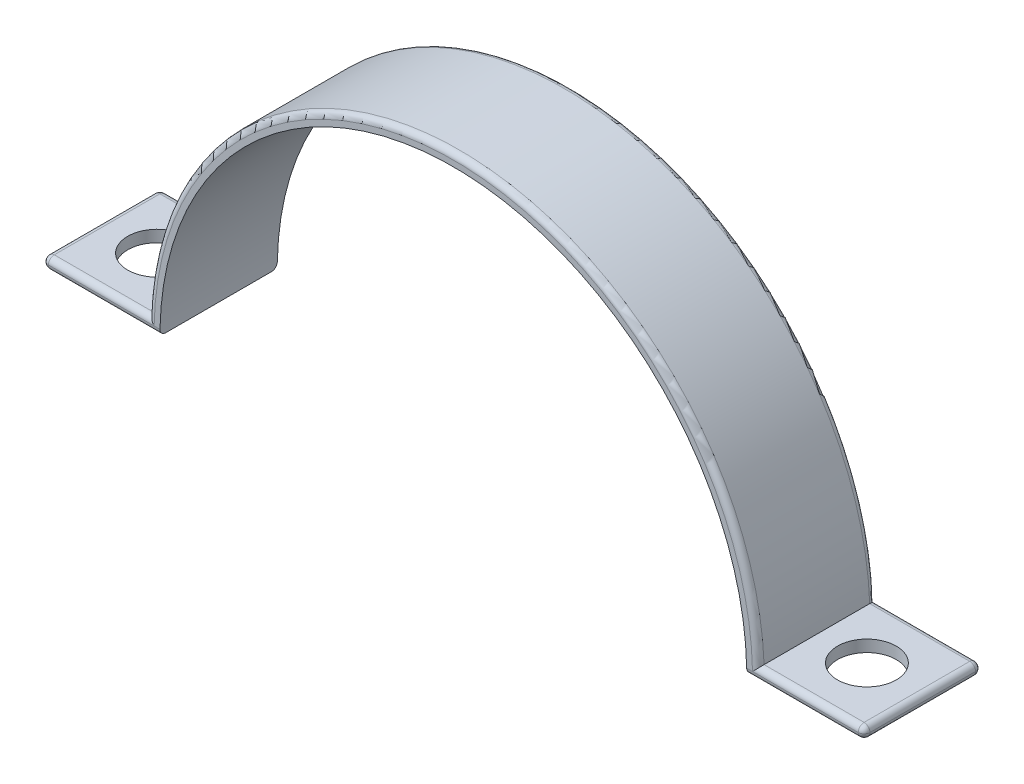
ISO-10303-21;
HEADER;
FILE_DESCRIPTION(('STEP AP214'),'2;1');
FILE_NAME('part.step','',(''),(''),'','','');
FILE_SCHEMA(('AUTOMOTIVE_DESIGN { 1 0 10303 214 1 1 1 1 }'));
ENDSEC;
DATA;
#1=APPLICATION_CONTEXT('core data for automotive mechanical design processes');
#2=APPLICATION_PROTOCOL_DEFINITION('international standard','automotive_design',2000,#1);
#3=PRODUCT_CONTEXT('',#1,'mechanical');
#4=PRODUCT('Part','Part','',(#3));
#5=PRODUCT_RELATED_PRODUCT_CATEGORY('part','',(#4));
#6=PRODUCT_DEFINITION_FORMATION('','',#4);
#7=PRODUCT_DEFINITION_CONTEXT('part definition',#1,'design');
#8=PRODUCT_DEFINITION('design','',#6,#7);
#9=PRODUCT_DEFINITION_SHAPE('','',#8);
#10=(LENGTH_UNIT() NAMED_UNIT(*) SI_UNIT(.MILLI.,.METRE.));
#11=(NAMED_UNIT(*) PLANE_ANGLE_UNIT() SI_UNIT($,.RADIAN.));
#12=(NAMED_UNIT(*) SI_UNIT($,.STERADIAN.) SOLID_ANGLE_UNIT());
#13=UNCERTAINTY_MEASURE_WITH_UNIT(LENGTH_MEASURE(1.E-05),#10,'distance_accuracy_value','');
#14=(GEOMETRIC_REPRESENTATION_CONTEXT(3) GLOBAL_UNCERTAINTY_ASSIGNED_CONTEXT((#13)) GLOBAL_UNIT_ASSIGNED_CONTEXT((#10,
#11,#12)) REPRESENTATION_CONTEXT('',''));
#15=CARTESIAN_POINT('',(0.,0.,0.));
#16=DIRECTION('',(0.,0.,1.));
#17=DIRECTION('',(1.,0.,0.));
#18=AXIS2_PLACEMENT_3D('',#15,#16,#17);
#19=CARTESIAN_POINT('',(0.,0.,20.));
#20=DIRECTION('',(0.,0.,-1.));
#21=DIRECTION('',(-1.,0.,0.));
#22=AXIS2_PLACEMENT_3D('',#19,#20,#21);
#23=CYLINDRICAL_SURFACE('',#22,50.);
#24=DIRECTION('',(0.,0.,-1.));
#25=VECTOR('',#24,1.);
#26=CARTESIAN_POINT('',(50.,0.,20.));
#27=LINE('',#26,#25);
#28=CARTESIAN_POINT('',(50.,0.,19.));
#29=VERTEX_POINT('',#28);
#30=CARTESIAN_POINT('',(50.,0.,1.));
#31=VERTEX_POINT('',#30);
#32=EDGE_CURVE('E165',#29,#31,#27,.T.);
#33=ORIENTED_EDGE('',*,*,#32,.F.);
#34=CARTESIAN_POINT('',(50.,0.,19.));
#35=CARTESIAN_POINT('',(49.9999998631864,1.87141236881629E-07,19.0281346403129));
#36=CARTESIAN_POINT('',(50.0000000153744,0.00118808187561963,19.0562558019718));
#37=CARTESIAN_POINT('',(49.9999997315055,0.00592707756846529,19.1122968966231));
#38=CARTESIAN_POINT('',(49.9999992954768,0.00947806520868897,19.1402168391998));
#39=CARTESIAN_POINT('',(49.9999953602963,0.0236419446843292,19.2233260784685));
#40=CARTESIAN_POINT('',(49.9999892412786,0.0377658465877786,19.2779586779832));
#41=CARTESIAN_POINT('',(49.9999471952478,0.0749847040579029,19.3840757024503));
#42=CARTESIAN_POINT('',(49.9999112539095,0.0980839681256297,19.4355586016728));
#43=CARTESIAN_POINT('',(49.9997745451526,0.152595409569771,19.5339141215954));
#44=CARTESIAN_POINT('',(49.9996737891469,0.184006122865026,19.5807875522715));
#45=CARTESIAN_POINT('',(49.9993658705842,0.254248519704559,19.6685928695787));
#46=CARTESIAN_POINT('',(49.9991587108456,0.293080006675595,19.7095249135442));
#47=CARTESIAN_POINT('',(49.9985957444102,0.377072144063286,19.7842972638465));
#48=CARTESIAN_POINT('',(49.9982399088935,0.42223402046767,19.8181361933055));
#49=CARTESIAN_POINT('',(49.9973435781473,0.517597393023219,19.8777537113069));
#50=CARTESIAN_POINT('',(49.9968030598717,0.567799517583145,19.9035312931227));
#51=CARTESIAN_POINT('',(49.9955135302985,0.671806447347662,19.9462797556067));
#52=CARTESIAN_POINT('',(49.994764640941,0.72560913153568,19.9632557704274));
#53=CARTESIAN_POINT('',(49.9933466602282,0.816450495060021,19.9837054885176));
#54=CARTESIAN_POINT('',(49.9927380940072,0.852919151252185,19.9898123691724));
#55=CARTESIAN_POINT('',(49.9914333721997,0.926253741143391,19.9979590931483));
#56=CARTESIAN_POINT('',(49.9907373424091,0.963119036097511,20.0000047080428));
#57=CARTESIAN_POINT('',(49.9899989998,1.,20.));
#58=B_SPLINE_CURVE_WITH_KNOTS('',3,(#34,#35,#36,#37,#38,#39,#40,#41,#42,#43,#44,#45,#46,#47,#48,
#49,#50,#51,#52,#53,#54,#55,#56,#57),.UNSPECIFIED.,.F.,.F.,(4,2,2,2,2,2,2,2,2,2,2,4),(0.,
0.0843520780065056,0.168700111339095,0.337118089257266,0.505617014025194,0.674086277051336,
0.842551078014438,1.01104855024937,1.17956705658551,1.34798715136615,1.45872081802652,
1.56929700514025),.UNSPECIFIED.);
#59=CARTESIAN_POINT('',(49.9899989998,1.,20.));
#60=VERTEX_POINT('',#59);
#61=EDGE_CURVE('E180',#29,#60,#58,.T.);
#62=ORIENTED_EDGE('',*,*,#61,.T.);
#63=CARTESIAN_POINT('',(0.,0.,20.));
#64=DIRECTION('',(0.,0.,-1.));
#65=DIRECTION('',(1.,0.,0.));
#66=AXIS2_PLACEMENT_3D('',#63,#64,#65);
#67=CIRCLE('',#66,50.);
#68=CARTESIAN_POINT('',(-49.9899989998,1.,20.));
#69=VERTEX_POINT('',#68);
#70=EDGE_CURVE('E161',#69,#60,#67,.T.);
#71=ORIENTED_EDGE('',*,*,#70,.F.);
#72=CARTESIAN_POINT('',(-49.9899989998,1.,20.));
#73=CARTESIAN_POINT('',(-49.9905618169273,0.971871419776289,19.9999998131516));
#74=CARTESIAN_POINT('',(-49.9911003274459,0.943755817033135,19.9988124284928));
#75=CARTESIAN_POINT('',(-49.9921266601252,0.887724773096459,19.994075227252));
#76=CARTESIAN_POINT('',(-49.9926144846497,0.859809322625408,19.990525520894));
#77=CARTESIAN_POINT('',(-49.9939973726587,0.776711854413031,19.9763662558612));
#78=CARTESIAN_POINT('',(-49.9948137171232,0.722084957229491,19.962246459446));
#79=CARTESIAN_POINT('',(-49.9962338543462,0.615975418546915,19.9250362270946));
#80=CARTESIAN_POINT('',(-49.9968375434462,0.564494320539792,19.9019414278125));
#81=CARTESIAN_POINT('',(-49.9978512799179,0.466140016660135,19.8474385230773));
#82=CARTESIAN_POINT('',(-49.9982613617648,0.41926599159476,19.816031899247));
#83=CARTESIAN_POINT('',(-49.9989206381703,0.331461702605881,19.7457999437537));
#84=CARTESIAN_POINT('',(-49.9991698511632,0.290530758073257,19.7069754627741));
#85=CARTESIAN_POINT('',(-49.9995484992326,0.215757973924678,19.6229969608851));
#86=CARTESIAN_POINT('',(-49.9996779107741,0.181917528251355,19.5778416982949));
#87=CARTESIAN_POINT('',(-49.999859373654,0.122291120517832,19.4824845222279));
#88=CARTESIAN_POINT('',(-49.9999114063117,0.0965071046293529,19.4322813932159));
#89=CARTESIAN_POINT('',(-49.9999757137407,0.0537461031393642,19.3282689399094));
#90=CARTESIAN_POINT('',(-49.9999880117839,0.0367639673397247,19.274461745305));
#91=CARTESIAN_POINT('',(-49.9999979976424,0.0163045231797023,19.1836050282424));
#92=CARTESIAN_POINT('',(-49.9999992464419,0.0101940376134749,19.1471266838145));
#93=CARTESIAN_POINT('',(-50.0000000054489,0.00204230346881125,19.0737706546755));
#94=CARTESIAN_POINT('',(-49.9999995181207,-4.70654190077639E-06,19.0368936100163));
#95=CARTESIAN_POINT('',(-50.,0.,19.));
#96=B_SPLINE_CURVE_WITH_KNOTS('',3,(#72,#73,#74,#75,#76,#77,#78,#79,#80,#81,#82,#83,#84,#85,#86,
#87,#88,#89,#90,#91,#92,#93,#94,#95),.UNSPECIFIED.,.F.,.F.,(4,2,2,2,2,2,2,2,2,2,2,4),(0.,
0.0843508233307579,0.168697711192303,0.337113723688326,0.505611717047594,0.674079695032367,
0.842528364607866,1.01101011900985,1.17953254172091,1.34795624614968,1.45870521936915,
1.56929705376736),.UNSPECIFIED.);
#97=CARTESIAN_POINT('',(-50.,0.,19.));
#98=VERTEX_POINT('',#97);
#99=EDGE_CURVE('E168',#69,#98,#96,.T.);
#100=ORIENTED_EDGE('',*,*,#99,.T.);
#101=DIRECTION('',(0.,0.,-1.));
#102=VECTOR('',#101,1.);
#103=CARTESIAN_POINT('',(-50.,0.,20.));
#104=LINE('',#103,#102);
#105=CARTESIAN_POINT('',(-50.,0.,1.));
#106=VERTEX_POINT('',#105);
#107=EDGE_CURVE('E181',#98,#106,#104,.T.);
#108=ORIENTED_EDGE('',*,*,#107,.T.);
#109=CARTESIAN_POINT('',(-50.,0.,1.));
#110=CARTESIAN_POINT('',(-49.9999998631864,1.87141236852758E-07,0.971865359687098));
#111=CARTESIAN_POINT('',(-50.0000000153744,0.00118808187561959,0.943744198028183));
#112=CARTESIAN_POINT('',(-49.9999997315055,0.00592707756846532,0.88770310337686));
#113=CARTESIAN_POINT('',(-49.9999992954768,0.00947806520868904,0.859783160800213));
#114=CARTESIAN_POINT('',(-49.9999953602963,0.0236419446843296,0.776673921531546));
#115=CARTESIAN_POINT('',(-49.9999892412786,0.0377658465877793,0.722041322016747));
#116=CARTESIAN_POINT('',(-49.9999471952478,0.0749847040579041,0.615924297549664));
#117=CARTESIAN_POINT('',(-49.9999112539095,0.0980839681256311,0.564441398327159));
#118=CARTESIAN_POINT('',(-49.9997745451526,0.152595409569773,0.466085878404552));
#119=CARTESIAN_POINT('',(-49.9996737891469,0.184006122865027,0.419212447728523));
#120=CARTESIAN_POINT('',(-49.9993658705842,0.25424851970456,0.331407130421346));
#121=CARTESIAN_POINT('',(-49.9991587108456,0.293080006675596,0.290475086455833));
#122=CARTESIAN_POINT('',(-49.9985957444102,0.377072144063287,0.215702736153533));
#123=CARTESIAN_POINT('',(-49.9982399088935,0.422234020467671,0.181863806694507));
#124=CARTESIAN_POINT('',(-49.9973435781473,0.51759739302322,0.122246288693089));
#125=CARTESIAN_POINT('',(-49.9968030598717,0.567799517583146,0.0964687068772508));
#126=CARTESIAN_POINT('',(-49.9955135302985,0.671806447347664,0.0537202443932561));
#127=CARTESIAN_POINT('',(-49.994764640941,0.725609131535682,0.036744229572606));
#128=CARTESIAN_POINT('',(-49.9933466602282,0.816450495060023,0.0162945114824068));
#129=CARTESIAN_POINT('',(-49.9927380940072,0.852919151252186,0.0101876308275691));
#130=CARTESIAN_POINT('',(-49.9914333721997,0.926253741143392,0.00204090685173931));
#131=CARTESIAN_POINT('',(-49.9907373424091,0.96311903609751,-4.70804282663039E-06));
#132=CARTESIAN_POINT('',(-49.9899989998,1.,0.));
#133=B_SPLINE_CURVE_WITH_KNOTS('',3,(#109,#110,#111,#112,#113,#114,#115,#116,#117,#118,#119,
#120,#121,#122,#123,#124,#125,#126,#127,#128,#129,#130,#131,#132),.UNSPECIFIED.,.F.,.F.,(4,2,2,
2,2,2,2,2,2,2,2,4),(0.,0.0843520780065075,0.168700111339098,0.337118089257268,0.505617014025199,
0.674086277051338,0.842551078014439,1.01104855024937,1.17956705658551,1.34798715136616,
1.45872081802652,1.56929700514025),.UNSPECIFIED.);
#134=CARTESIAN_POINT('',(-49.9899989998,1.,0.));
#135=VERTEX_POINT('',#134);
#136=EDGE_CURVE('E176',#106,#135,#133,.T.);
#137=ORIENTED_EDGE('',*,*,#136,.T.);
#138=CARTESIAN_POINT('',(0.,0.,0.));
#139=DIRECTION('',(0.,0.,-1.));
#140=DIRECTION('',(1.,0.,0.));
#141=AXIS2_PLACEMENT_3D('',#138,#139,#140);
#142=CIRCLE('',#141,50.);
#143=CARTESIAN_POINT('',(49.9899989998,1.,0.));
#144=VERTEX_POINT('',#143);
#145=EDGE_CURVE('E182',#135,#144,#142,.T.);
#146=ORIENTED_EDGE('',*,*,#145,.T.);
#147=CARTESIAN_POINT('',(49.9899989998,1.,0.));
#148=CARTESIAN_POINT('',(49.9905618169273,0.971871419776289,1.8684843894341E-07));
#149=CARTESIAN_POINT('',(49.9911003274459,0.943755817033135,0.00118757150715081));
#150=CARTESIAN_POINT('',(49.9921266601252,0.887724773096459,0.00592477274801115));
#151=CARTESIAN_POINT('',(49.9926144846497,0.859809322625408,0.00947447910602955));
#152=CARTESIAN_POINT('',(49.9939973726587,0.776711854413032,0.0236337441388272));
#153=CARTESIAN_POINT('',(49.9948137171232,0.722084957229491,0.0377535405539762));
#154=CARTESIAN_POINT('',(49.9962338543462,0.615975418546915,0.0749637729053945));
#155=CARTESIAN_POINT('',(49.9968375434462,0.564494320539791,0.0980585721874759));
#156=CARTESIAN_POINT('',(49.9978512799179,0.466140016660134,0.152561476922694));
#157=CARTESIAN_POINT('',(49.9982613617648,0.419265991594761,0.183968100752958));
#158=CARTESIAN_POINT('',(49.9989206381703,0.331461702605881,0.254200056246344));
#159=CARTESIAN_POINT('',(49.9991698511632,0.290530758073257,0.293024537225849));
#160=CARTESIAN_POINT('',(49.9995484992326,0.215757973924678,0.377003039114936));
#161=CARTESIAN_POINT('',(49.9996779107741,0.181917528251355,0.422158301705106));
#162=CARTESIAN_POINT('',(49.999859373654,0.122291120517833,0.517515477772131));
#163=CARTESIAN_POINT('',(49.9999114063117,0.0965071046293539,0.567718606784102));
#164=CARTESIAN_POINT('',(49.9999757137407,0.053746103139365,0.671731060090621));
#165=CARTESIAN_POINT('',(49.9999880117839,0.0367639673397253,0.725538254695006));
#166=CARTESIAN_POINT('',(49.9999979976424,0.0163045231797029,0.816394971757621));
#167=CARTESIAN_POINT('',(49.9999992464419,0.0101940376134754,0.852873316185527));
#168=CARTESIAN_POINT('',(50.0000000054489,0.00204230346881128,0.926229345324475));
#169=CARTESIAN_POINT('',(49.9999995181207,-4.70654190093722E-06,0.963106389983723));
#170=CARTESIAN_POINT('',(50.,0.,1.));
#171=B_SPLINE_CURVE_WITH_KNOTS('',3,(#147,#148,#149,#150,#151,#152,#153,#154,#155,#156,#157,
#158,#159,#160,#161,#162,#163,#164,#165,#166,#167,#168,#169,#170),.UNSPECIFIED.,.F.,.F.,(4,2,2,
2,2,2,2,2,2,2,2,4),(0.,0.0843508233307579,0.168697711192303,0.337113723688326,0.505611717047597,
0.674079695032367,0.842528364607865,1.01101011900985,1.17953254172091,1.34795624614968,
1.45870521936914,1.56929705376736),.UNSPECIFIED.);
#172=EDGE_CURVE('E228',#144,#31,#171,.T.);
#173=ORIENTED_EDGE('',*,*,#172,.T.);
#174=EDGE_LOOP('',(#33,#62,#71,#100,#108,#137,#146,#173));
#175=FACE_BOUND('',#174,.T.);
#176=ADVANCED_FACE('F35',(#175),#23,.F.);
#177=CARTESIAN_POINT('',(50.,0.,20.));
#178=DIRECTION('',(0.,1.,0.));
#179=DIRECTION('',(0.,0.,1.));
#180=AXIS2_PLACEMENT_3D('',#177,#178,#179);
#181=PLANE('',#180);
#182=CARTESIAN_POINT('',(60.4799919935936,0.,10.));
#183=DIRECTION('',(0.,1.,0.));
#184=DIRECTION('',(0.,0.,1.));
#185=AXIS2_PLACEMENT_3D('',#182,#183,#184);
#186=CIRCLE('',#185,5.);
#187=CARTESIAN_POINT('',(60.4799919935936,0.,15.));
#188=VERTEX_POINT('',#187);
#189=EDGE_CURVE('E510',#188,#188,#186,.T.);
#190=ORIENTED_EDGE('',*,*,#189,.T.);
#191=EDGE_LOOP('',(#190));
#192=FACE_BOUND('',#191,.T.);
#193=DIRECTION('',(0.,0.,-1.));
#194=VECTOR('',#193,1.);
#195=CARTESIAN_POINT('',(69.,0.,20.));
#196=LINE('',#195,#194);
#197=CARTESIAN_POINT('',(69.,0.,1.));
#198=VERTEX_POINT('',#197);
#199=CARTESIAN_POINT('',(69.,0.,19.));
#200=VERTEX_POINT('',#199);
#201=EDGE_CURVE('E366',#198,#200,#196,.F.);
#202=ORIENTED_EDGE('',*,*,#201,.T.);
#203=DIRECTION('',(1.,0.,0.));
#204=VECTOR('',#203,1.);
#205=CARTESIAN_POINT('',(50.,0.,19.));
#206=LINE('',#205,#204);
#207=EDGE_CURVE('E235',#200,#29,#206,.F.);
#208=ORIENTED_EDGE('',*,*,#207,.T.);
#209=ORIENTED_EDGE('',*,*,#32,.T.);
#210=DIRECTION('',(1.,0.,0.));
#211=VECTOR('',#210,1.);
#212=CARTESIAN_POINT('',(50.,0.,1.));
#213=LINE('',#212,#211);
#214=EDGE_CURVE('E367',#31,#198,#213,.T.);
#215=ORIENTED_EDGE('',*,*,#214,.T.);
#216=EDGE_LOOP('',(#202,#208,#209,#215));
#217=FACE_BOUND('',#216,.T.);
#218=ADVANCED_FACE('F219',(#192,#217),#181,.F.);
#219=CARTESIAN_POINT('',(51.9599839871872,2.,20.));
#220=DIRECTION('',(0.,-1.,0.));
#221=DIRECTION('',(0.,0.,-1.));
#222=AXIS2_PLACEMENT_3D('',#219,#220,#221);
#223=PLANE('',#222);
#224=CARTESIAN_POINT('',(60.4799919935936,2.,10.));
#225=DIRECTION('',(0.,1.,0.));
#226=DIRECTION('',(0.,0.,1.));
#227=AXIS2_PLACEMENT_3D('',#224,#225,#226);
#228=CIRCLE('',#227,5.);
#229=CARTESIAN_POINT('',(60.4799919935936,2.,15.));
#230=VERTEX_POINT('',#229);
#231=EDGE_CURVE('E190',#230,#230,#228,.T.);
#232=ORIENTED_EDGE('',*,*,#231,.F.);
#233=EDGE_LOOP('',(#232));
#234=FACE_BOUND('',#233,.T.);
#235=DIRECTION('',(0.,0.,-1.));
#236=VECTOR('',#235,1.);
#237=CARTESIAN_POINT('',(51.9599839871872,2.,20.));
#238=LINE('',#237,#236);
#239=CARTESIAN_POINT('',(51.9599839871872,2.,19.));
#240=VERTEX_POINT('',#239);
#241=CARTESIAN_POINT('',(51.9599839871872,2.,1.));
#242=VERTEX_POINT('',#241);
#243=EDGE_CURVE('E195',#240,#242,#238,.T.);
#244=ORIENTED_EDGE('',*,*,#243,.F.);
#245=DIRECTION('',(-1.,0.,0.));
#246=VECTOR('',#245,1.);
#247=CARTESIAN_POINT('',(69.,2.,19.));
#248=LINE('',#247,#246);
#249=CARTESIAN_POINT('',(69.,2.,19.));
#250=VERTEX_POINT('',#249);
#251=EDGE_CURVE('E389',#240,#250,#248,.F.);
#252=ORIENTED_EDGE('',*,*,#251,.T.);
#253=DIRECTION('',(0.,0.,-1.));
#254=VECTOR('',#253,1.);
#255=CARTESIAN_POINT('',(69.,2.,20.));
#256=LINE('',#255,#254);
#257=CARTESIAN_POINT('',(69.,2.,1.));
#258=VERTEX_POINT('',#257);
#259=EDGE_CURVE('E383',#250,#258,#256,.T.);
#260=ORIENTED_EDGE('',*,*,#259,.T.);
#261=DIRECTION('',(-1.,0.,0.));
#262=VECTOR('',#261,1.);
#263=CARTESIAN_POINT('',(51.9599839871872,2.,1.));
#264=LINE('',#263,#262);
#265=EDGE_CURVE('E386',#258,#242,#264,.T.);
#266=ORIENTED_EDGE('',*,*,#265,.T.);
#267=EDGE_LOOP('',(#244,#252,#260,#266));
#268=FACE_BOUND('',#267,.T.);
#269=ADVANCED_FACE('F444',(#234,#268),#223,.F.);
#270=CARTESIAN_POINT('',(0.,0.,20.));
#271=DIRECTION('',(0.,0.,-1.));
#272=DIRECTION('',(-1.,0.,0.));
#273=AXIS2_PLACEMENT_3D('',#270,#271,#272);
#274=CYLINDRICAL_SURFACE('',#273,51.9984608998069);
#275=ORIENTED_EDGE('',*,*,#243,.T.);
#276=CARTESIAN_POINT('',(0.,0.,1.));
#277=DIRECTION('',(0.,0.,1.));
#278=DIRECTION('',(1.,0.,0.));
#279=AXIS2_PLACEMENT_3D('',#276,#277,#278);
#280=CIRCLE('',#279,51.9984608998069);
#281=CARTESIAN_POINT('',(-51.9599839871872,2.,1.));
#282=VERTEX_POINT('',#281);
#283=EDGE_CURVE('E426',#242,#282,#280,.T.);
#284=ORIENTED_EDGE('',*,*,#283,.T.);
#285=DIRECTION('',(0.,0.,-1.));
#286=VECTOR('',#285,1.);
#287=CARTESIAN_POINT('',(-51.9599839871872,2.,20.));
#288=LINE('',#287,#286);
#289=CARTESIAN_POINT('',(-51.9599839871872,2.,19.));
#290=VERTEX_POINT('',#289);
#291=EDGE_CURVE('E184',#290,#282,#288,.T.);
#292=ORIENTED_EDGE('',*,*,#291,.F.);
#293=CARTESIAN_POINT('',(0.,0.,19.));
#294=DIRECTION('',(0.,0.,1.));
#295=DIRECTION('',(1.,0.,0.));
#296=AXIS2_PLACEMENT_3D('',#293,#294,#295);
#297=CIRCLE('',#296,51.9984608998069);
#298=EDGE_CURVE('E391',#290,#240,#297,.F.);
#299=ORIENTED_EDGE('',*,*,#298,.T.);
#300=EDGE_LOOP('',(#275,#284,#292,#299));
#301=FACE_BOUND('',#300,.T.);
#302=ADVANCED_FACE('F448',(#301),#274,.T.);
#303=CARTESIAN_POINT('',(-70.,2.,20.));
#304=DIRECTION('',(0.,-1.,0.));
#305=DIRECTION('',(0.,0.,-1.));
#306=AXIS2_PLACEMENT_3D('',#303,#304,#305);
#307=PLANE('',#306);
#308=CARTESIAN_POINT('',(-60.4799919935936,2.,10.));
#309=DIRECTION('',(0.,1.,0.));
#310=DIRECTION('',(0.,0.,1.));
#311=AXIS2_PLACEMENT_3D('',#308,#309,#310);
#312=CIRCLE('',#311,5.);
#313=CARTESIAN_POINT('',(-60.4799919935936,2.,15.));
#314=VERTEX_POINT('',#313);
#315=EDGE_CURVE('E512',#314,#314,#312,.T.);
#316=ORIENTED_EDGE('',*,*,#315,.F.);
#317=EDGE_LOOP('',(#316));
#318=FACE_BOUND('',#317,.T.);
#319=DIRECTION('',(0.,0.,-1.));
#320=VECTOR('',#319,1.);
#321=CARTESIAN_POINT('',(-69.,2.,20.));
#322=LINE('',#321,#320);
#323=CARTESIAN_POINT('',(-69.,2.,1.));
#324=VERTEX_POINT('',#323);
#325=CARTESIAN_POINT('',(-69.,2.,19.));
#326=VERTEX_POINT('',#325);
#327=EDGE_CURVE('E324',#324,#326,#322,.F.);
#328=ORIENTED_EDGE('',*,*,#327,.T.);
#329=DIRECTION('',(-1.,0.,0.));
#330=VECTOR('',#329,1.);
#331=CARTESIAN_POINT('',(-51.9599839871872,2.,19.));
#332=LINE('',#331,#330);
#333=EDGE_CURVE('E333',#326,#290,#332,.F.);
#334=ORIENTED_EDGE('',*,*,#333,.T.);
#335=ORIENTED_EDGE('',*,*,#291,.T.);
#336=DIRECTION('',(-1.,0.,0.));
#337=VECTOR('',#336,1.);
#338=CARTESIAN_POINT('',(-70.,2.,1.));
#339=LINE('',#338,#337);
#340=EDGE_CURVE('E330',#282,#324,#339,.T.);
#341=ORIENTED_EDGE('',*,*,#340,.T.);
#342=EDGE_LOOP('',(#328,#334,#335,#341));
#343=FACE_BOUND('',#342,.T.);
#344=ADVANCED_FACE('F495',(#318,#343),#307,.F.);
#345=CARTESIAN_POINT('',(-50.,0.,20.));
#346=DIRECTION('',(0.,1.,0.));
#347=DIRECTION('',(-1.,0.,0.));
#348=AXIS2_PLACEMENT_3D('',#345,#346,#347);
#349=PLANE('',#348);
#350=CARTESIAN_POINT('',(-60.4799919935936,0.,10.));
#351=DIRECTION('',(0.,1.,0.));
#352=DIRECTION('',(0.,0.,1.));
#353=AXIS2_PLACEMENT_3D('',#350,#351,#352);
#354=CIRCLE('',#353,5.);
#355=CARTESIAN_POINT('',(-60.4799919935936,0.,15.));
#356=VERTEX_POINT('',#355);
#357=EDGE_CURVE('E394',#356,#356,#354,.T.);
#358=ORIENTED_EDGE('',*,*,#357,.T.);
#359=EDGE_LOOP('',(#358));
#360=FACE_BOUND('',#359,.T.);
#361=ORIENTED_EDGE('',*,*,#107,.F.);
#362=DIRECTION('',(1.,0.,0.));
#363=VECTOR('',#362,1.);
#364=CARTESIAN_POINT('',(-69.,0.,19.));
#365=LINE('',#364,#363);
#366=CARTESIAN_POINT('',(-69.,0.,19.));
#367=VERTEX_POINT('',#366);
#368=EDGE_CURVE('E171',#98,#367,#365,.F.);
#369=ORIENTED_EDGE('',*,*,#368,.T.);
#370=DIRECTION('',(0.,0.,-1.));
#371=VECTOR('',#370,1.);
#372=CARTESIAN_POINT('',(-69.,0.,20.));
#373=LINE('',#372,#371);
#374=CARTESIAN_POINT('',(-69.,0.,1.));
#375=VERTEX_POINT('',#374);
#376=EDGE_CURVE('E175',#367,#375,#373,.T.);
#377=ORIENTED_EDGE('',*,*,#376,.T.);
#378=DIRECTION('',(1.,0.,0.));
#379=VECTOR('',#378,1.);
#380=CARTESIAN_POINT('',(-50.,0.,1.));
#381=LINE('',#380,#379);
#382=EDGE_CURVE('E732',#375,#106,#381,.T.);
#383=ORIENTED_EDGE('',*,*,#382,.T.);
#384=EDGE_LOOP('',(#361,#369,#377,#383));
#385=FACE_BOUND('',#384,.T.);
#386=ADVANCED_FACE('F489',(#360,#385),#349,.F.);
#387=CARTESIAN_POINT('',(0.,0.,20.));
#388=DIRECTION('',(0.,0.,1.));
#389=DIRECTION('',(1.,0.,0.));
#390=AXIS2_PLACEMENT_3D('',#387,#388,#389);
#391=PLANE('',#390);
#392=DIRECTION('',(1.,0.,0.));
#393=VECTOR('',#392,1.);
#394=CARTESIAN_POINT('',(69.,1.,20.));
#395=LINE('',#394,#393);
#396=CARTESIAN_POINT('',(50.9886557397735,1.,20.));
#397=VERTEX_POINT('',#396);
#398=EDGE_CURVE('E340',#60,#397,#395,.T.);
#399=ORIENTED_EDGE('',*,*,#398,.T.);
#400=CARTESIAN_POINT('',(0.,0.,20.));
#401=DIRECTION('',(0.,0.,1.));
#402=DIRECTION('',(1.,0.,0.));
#403=AXIS2_PLACEMENT_3D('',#400,#401,#402);
#404=CIRCLE('',#403,50.9984608998069);
#405=CARTESIAN_POINT('',(-50.9886557397735,1.,20.));
#406=VERTEX_POINT('',#405);
#407=EDGE_CURVE('E162',#397,#406,#404,.T.);
#408=ORIENTED_EDGE('',*,*,#407,.T.);
#409=DIRECTION('',(1.,0.,0.));
#410=VECTOR('',#409,1.);
#411=CARTESIAN_POINT('',(-50.,1.,20.));
#412=LINE('',#411,#410);
#413=EDGE_CURVE('E156',#406,#69,#412,.T.);
#414=ORIENTED_EDGE('',*,*,#413,.T.);
#415=ORIENTED_EDGE('',*,*,#70,.T.);
#416=EDGE_LOOP('',(#399,#408,#414,#415));
#417=FACE_BOUND('',#416,.T.);
#418=ADVANCED_FACE('F159',(#417),#391,.T.);
#419=CARTESIAN_POINT('',(0.,0.,0.));
#420=DIRECTION('',(0.,0.,1.));
#421=DIRECTION('',(1.,0.,0.));
#422=AXIS2_PLACEMENT_3D('',#419,#420,#421);
#423=PLANE('',#422);
#424=DIRECTION('',(1.,0.,0.));
#425=VECTOR('',#424,1.);
#426=CARTESIAN_POINT('',(0.,1.00000000000001,0.));
#427=LINE('',#426,#425);
#428=CARTESIAN_POINT('',(-50.9886557397735,1.,0.));
#429=VERTEX_POINT('',#428);
#430=EDGE_CURVE('E331',#135,#429,#427,.F.);
#431=ORIENTED_EDGE('',*,*,#430,.T.);
#432=CARTESIAN_POINT('',(0.,0.,0.));
#433=DIRECTION('',(0.,0.,1.));
#434=DIRECTION('',(1.,0.,0.));
#435=AXIS2_PLACEMENT_3D('',#432,#433,#434);
#436=CIRCLE('',#435,50.9984608998069);
#437=CARTESIAN_POINT('',(50.9886557397735,1.,0.));
#438=VERTEX_POINT('',#437);
#439=EDGE_CURVE('E429',#429,#438,#436,.F.);
#440=ORIENTED_EDGE('',*,*,#439,.T.);
#441=DIRECTION('',(1.,0.,0.));
#442=VECTOR('',#441,1.);
#443=CARTESIAN_POINT('',(0.,1.,0.));
#444=LINE('',#443,#442);
#445=EDGE_CURVE('E377',#438,#144,#444,.F.);
#446=ORIENTED_EDGE('',*,*,#445,.T.);
#447=ORIENTED_EDGE('',*,*,#145,.F.);
#448=EDGE_LOOP('',(#431,#440,#446,#447));
#449=FACE_BOUND('',#448,.T.);
#450=ADVANCED_FACE('F437',(#449),#423,.F.);
#451=CARTESIAN_POINT('',(-70.,0.999999999999997,1.));
#452=DIRECTION('',(-1.,0.,0.));
#453=DIRECTION('',(0.,0.,1.));
#454=AXIS2_PLACEMENT_3D('',#451,#452,#453);
#455=CYLINDRICAL_SURFACE('',#454,1.);
#456=ORIENTED_EDGE('',*,*,#340,.F.);
#457=CARTESIAN_POINT('',(-51.9599839871872,2.,1.));
#458=CARTESIAN_POINT('',(-51.959986728874,2.00000290412781,0.977340201542314));
#459=CARTESIAN_POINT('',(-51.9592422219622,1.99922912942418,0.954694124972459));
#460=CARTESIAN_POINT('',(-51.9562914490493,1.99616270039603,0.909617088119186));
#461=CARTESIAN_POINT('',(-51.9540862478196,1.99387115245053,0.887185983206263));
#462=CARTESIAN_POINT('',(-51.9453794130621,1.98482424749758,0.82084611341973));
#463=CARTESIAN_POINT('',(-51.9367852129347,1.97589522621077,0.777478080947846));
#464=CARTESIAN_POINT('',(-51.9146524619155,1.95290939887212,0.693643201534502));
#465=CARTESIAN_POINT('',(-51.9011264362603,1.93886558284122,0.653169313149648));
#466=CARTESIAN_POINT('',(-51.8699079027862,1.90646877596712,0.575636078221885));
#467=CARTESIAN_POINT('',(-51.8522065477257,1.88810663513362,0.538584217964745));
#468=CARTESIAN_POINT('',(-51.8059175013433,1.8401194206084,0.454697756764548));
#469=CARTESIAN_POINT('',(-51.7757705328517,1.80888841749414,0.409643979485024));
#470=CARTESIAN_POINT('',(-51.710811046171,1.74166186293871,0.327108671420807));
#471=CARTESIAN_POINT('',(-51.6759899916897,1.705657595597,0.289641317429202));
#472=CARTESIAN_POINT('',(-51.589684777119,1.61651989147552,0.209628633352497));
#473=CARTESIAN_POINT('',(-51.5367677063595,1.56194152189722,0.170247023451029));
#474=CARTESIAN_POINT('',(-51.427175504953,1.44909732458231,0.104122521777876));
#475=CARTESIAN_POINT('',(-51.3704961163885,1.39082732244268,0.0773942380786842));
#476=CARTESIAN_POINT('',(-51.2605920108518,1.27803408472851,0.037755201208999));
#477=CARTESIAN_POINT('',(-51.2075621998507,1.22369238109076,0.0237594143992866));
#478=CARTESIAN_POINT('',(-51.1007152126206,1.11437587774813,0.00502018320189596));
#479=CARTESIAN_POINT('',(-51.0468998609117,1.05940259366903,0.000257944213633115));
#480=CARTESIAN_POINT('',(-50.9916080041798,1.00301079753434,3.40299969104842E-06));
#481=CARTESIAN_POINT('',(-50.9901318675135,1.00150536131923,4.06254750842467E-09));
#482=CARTESIAN_POINT('',(-50.9886557397735,0.999999999999997,0.));
#483=B_SPLINE_CURVE_WITH_KNOTS('',3,(#457,#458,#459,#460,#461,#462,#463,#464,#465,#466,#467,
#468,#469,#470,#471,#472,#473,#474,#475,#476,#477,#478,#479,#480,#481,#482),.UNSPECIFIED.,.F.,
.F.,(4,2,2,2,2,2,2,2,2,2,2,2,4),(0.,0.0679279408037437,0.13580642003177,0.270344396899092,
0.404543044153806,0.539028645050572,0.725684674109838,0.912686353051488,1.1681581071146,
1.42392408447562,1.65499262059123,1.88559032805101,1.89191549967414),.UNSPECIFIED.);
#484=EDGE_CURVE('E268',#282,#429,#483,.T.);
#485=ORIENTED_EDGE('',*,*,#484,.T.);
#486=DIRECTION('',(-1.,0.,0.));
#487=VECTOR('',#486,1.);
#488=CARTESIAN_POINT('',(0.,0.999999999999997,0.));
#489=LINE('',#488,#487);
#490=CARTESIAN_POINT('',(-69.,0.999999999999998,0.));
#491=VERTEX_POINT('',#490);
#492=EDGE_CURVE('E187',#491,#429,#489,.F.);
#493=ORIENTED_EDGE('',*,*,#492,.F.);
#494=CARTESIAN_POINT('',(-69.,0.999999999999997,1.));
#495=DIRECTION('',(-1.,0.,0.));
#496=DIRECTION('',(0.,0.,1.));
#497=AXIS2_PLACEMENT_3D('',#494,#495,#496);
#498=CIRCLE('',#497,1.);
#499=EDGE_CURVE('E316',#324,#491,#498,.T.);
#500=ORIENTED_EDGE('',*,*,#499,.F.);
#501=EDGE_LOOP('',(#456,#485,#493,#500));
#502=FACE_BOUND('',#501,.T.);
#503=ADVANCED_FACE('F308',(#502),#455,.T.);
#504=CARTESIAN_POINT('',(-50.,1.,1.));
#505=DIRECTION('',(1.,0.,0.));
#506=DIRECTION('',(0.,1.,0.));
#507=AXIS2_PLACEMENT_3D('',#504,#505,#506);
#508=CYLINDRICAL_SURFACE('',#507,1.);
#509=ORIENTED_EDGE('',*,*,#136,.F.);
#510=ORIENTED_EDGE('',*,*,#382,.F.);
#511=CARTESIAN_POINT('',(-69.,0.999999999999998,1.));
#512=DIRECTION('',(-1.,0.,0.));
#513=DIRECTION('',(0.,0.,1.));
#514=AXIS2_PLACEMENT_3D('',#511,#512,#513);
#515=CIRCLE('',#514,1.);
#516=EDGE_CURVE('E360',#491,#375,#515,.T.);
#517=ORIENTED_EDGE('',*,*,#516,.F.);
#518=ORIENTED_EDGE('',*,*,#492,.T.);
#519=ORIENTED_EDGE('',*,*,#430,.F.);
#520=EDGE_LOOP('',(#509,#510,#517,#518,#519));
#521=FACE_BOUND('',#520,.T.);
#522=ADVANCED_FACE('F212',(#521),#508,.T.);
#523=CARTESIAN_POINT('',(-69.,0.999999999999997,1.));
#524=DIRECTION('',(0.,-1.,0.));
#525=DIRECTION('',(0.,0.,-1.));
#526=AXIS2_PLACEMENT_3D('',#523,#524,#525);
#527=SPHERICAL_SURFACE('',#526,1.);
#528=CARTESIAN_POINT('',(-69.,0.999999999999997,1.));
#529=DIRECTION('',(0.,0.,1.));
#530=DIRECTION('',(1.,0.,0.));
#531=AXIS2_PLACEMENT_3D('',#528,#529,#530);
#532=CIRCLE('',#531,1.);
#533=CARTESIAN_POINT('',(-70.,0.999999999999998,1.));
#534=VERTEX_POINT('',#533);
#535=EDGE_CURVE('E313',#324,#534,#532,.T.);
#536=ORIENTED_EDGE('',*,*,#535,.F.);
#537=ORIENTED_EDGE('',*,*,#499,.T.);
#538=CARTESIAN_POINT('',(-69.,0.999999999999997,1.));
#539=DIRECTION('',(0.,-1.,0.));
#540=DIRECTION('',(0.,0.,-1.));
#541=AXIS2_PLACEMENT_3D('',#538,#539,#540);
#542=CIRCLE('',#541,1.);
#543=EDGE_CURVE('E319',#534,#491,#542,.T.);
#544=ORIENTED_EDGE('',*,*,#543,.F.);
#545=EDGE_LOOP('',(#536,#537,#544));
#546=FACE_BOUND('',#545,.T.);
#547=ADVANCED_FACE('F301',(#546),#527,.T.);
#548=CARTESIAN_POINT('',(-69.,0.999999999999998,1.));
#549=DIRECTION('',(0.,1.,0.));
#550=DIRECTION('',(-1.,0.,0.));
#551=AXIS2_PLACEMENT_3D('',#548,#549,#550);
#552=SPHERICAL_SURFACE('',#551,1.);
#553=ORIENTED_EDGE('',*,*,#543,.T.);
#554=ORIENTED_EDGE('',*,*,#516,.T.);
#555=CARTESIAN_POINT('',(-69.,0.999999999999998,1.));
#556=DIRECTION('',(0.,0.,1.));
#557=DIRECTION('',(1.,0.,0.));
#558=AXIS2_PLACEMENT_3D('',#555,#556,#557);
#559=CIRCLE('',#558,1.);
#560=EDGE_CURVE('E321',#534,#375,#559,.T.);
#561=ORIENTED_EDGE('',*,*,#560,.F.);
#562=EDGE_LOOP('',(#553,#554,#561));
#563=FACE_BOUND('',#562,.T.);
#564=ADVANCED_FACE('F298',(#563),#552,.T.);
#565=CARTESIAN_POINT('',(-69.,0.999999999999997,20.));
#566=DIRECTION('',(0.,0.,-1.));
#567=DIRECTION('',(-1.,0.,0.));
#568=AXIS2_PLACEMENT_3D('',#565,#566,#567);
#569=CYLINDRICAL_SURFACE('',#568,1.);
#570=ORIENTED_EDGE('',*,*,#327,.F.);
#571=ORIENTED_EDGE('',*,*,#535,.T.);
#572=DIRECTION('',(0.,0.,-1.));
#573=VECTOR('',#572,1.);
#574=CARTESIAN_POINT('',(-70.,0.999999999999997,20.));
#575=LINE('',#574,#573);
#576=CARTESIAN_POINT('',(-70.,0.999999999999998,19.));
#577=VERTEX_POINT('',#576);
#578=EDGE_CURVE('E354',#577,#534,#575,.T.);
#579=ORIENTED_EDGE('',*,*,#578,.F.);
#580=CARTESIAN_POINT('',(-69.,0.999999999999997,19.));
#581=DIRECTION('',(0.,0.,1.));
#582=DIRECTION('',(1.,0.,0.));
#583=AXIS2_PLACEMENT_3D('',#580,#581,#582);
#584=CIRCLE('',#583,1.);
#585=EDGE_CURVE('E326',#326,#577,#584,.T.);
#586=ORIENTED_EDGE('',*,*,#585,.F.);
#587=EDGE_LOOP('',(#570,#571,#579,#586));
#588=FACE_BOUND('',#587,.T.);
#589=ADVANCED_FACE('F294',(#588),#569,.T.);
#590=CARTESIAN_POINT('',(-69.,0.999999999999998,20.));
#591=DIRECTION('',(0.,0.,-1.));
#592=DIRECTION('',(-1.,0.,0.));
#593=AXIS2_PLACEMENT_3D('',#590,#591,#592);
#594=CYLINDRICAL_SURFACE('',#593,1.);
#595=ORIENTED_EDGE('',*,*,#560,.T.);
#596=ORIENTED_EDGE('',*,*,#376,.F.);
#597=CARTESIAN_POINT('',(-69.,0.999999999999998,19.));
#598=DIRECTION('',(0.,0.,1.));
#599=DIRECTION('',(1.,0.,0.));
#600=AXIS2_PLACEMENT_3D('',#597,#598,#599);
#601=CIRCLE('',#600,1.);
#602=EDGE_CURVE('E350',#577,#367,#601,.T.);
#603=ORIENTED_EDGE('',*,*,#602,.F.);
#604=ORIENTED_EDGE('',*,*,#578,.T.);
#605=EDGE_LOOP('',(#595,#596,#603,#604));
#606=FACE_BOUND('',#605,.T.);
#607=ADVANCED_FACE('F290',(#606),#594,.T.);
#608=CARTESIAN_POINT('',(-69.,0.999999999999997,19.));
#609=DIRECTION('',(0.,-1.,0.));
#610=DIRECTION('',(0.,0.,-1.));
#611=AXIS2_PLACEMENT_3D('',#608,#609,#610);
#612=SPHERICAL_SURFACE('',#611,1.);
#613=CARTESIAN_POINT('',(-69.,0.999999999999997,19.));
#614=DIRECTION('',(1.,0.,0.));
#615=DIRECTION('',(0.,0.,-1.));
#616=AXIS2_PLACEMENT_3D('',#613,#614,#615);
#617=CIRCLE('',#616,1.);
#618=CARTESIAN_POINT('',(-69.,0.999999999999998,20.));
#619=VERTEX_POINT('',#618);
#620=EDGE_CURVE('E343',#326,#619,#617,.T.);
#621=ORIENTED_EDGE('',*,*,#620,.F.);
#622=ORIENTED_EDGE('',*,*,#585,.T.);
#623=CARTESIAN_POINT('',(-69.,0.999999999999997,19.));
#624=DIRECTION('',(0.,1.,0.));
#625=DIRECTION('',(0.,0.,1.));
#626=AXIS2_PLACEMENT_3D('',#623,#624,#625);
#627=CIRCLE('',#626,1.);
#628=EDGE_CURVE('E347',#619,#577,#627,.F.);
#629=ORIENTED_EDGE('',*,*,#628,.F.);
#630=EDGE_LOOP('',(#621,#622,#629));
#631=FACE_BOUND('',#630,.T.);
#632=ADVANCED_FACE('F286',(#631),#612,.T.);
#633=CARTESIAN_POINT('',(-69.,0.999999999999998,19.));
#634=DIRECTION('',(0.,1.,0.));
#635=DIRECTION('',(-1.,0.,0.));
#636=AXIS2_PLACEMENT_3D('',#633,#634,#635);
#637=SPHERICAL_SURFACE('',#636,1.);
#638=ORIENTED_EDGE('',*,*,#628,.T.);
#639=ORIENTED_EDGE('',*,*,#602,.T.);
#640=CARTESIAN_POINT('',(-69.,0.999999999999998,19.));
#641=DIRECTION('',(1.,0.,0.));
#642=DIRECTION('',(0.,0.,-1.));
#643=AXIS2_PLACEMENT_3D('',#640,#641,#642);
#644=CIRCLE('',#643,1.);
#645=EDGE_CURVE('E341',#619,#367,#644,.T.);
#646=ORIENTED_EDGE('',*,*,#645,.F.);
#647=EDGE_LOOP('',(#638,#639,#646));
#648=FACE_BOUND('',#647,.T.);
#649=ADVANCED_FACE('F282',(#648),#637,.T.);
#650=CARTESIAN_POINT('',(0.,0.999999999999997,19.));
#651=DIRECTION('',(1.,0.,0.));
#652=DIRECTION('',(0.,0.,-1.));
#653=AXIS2_PLACEMENT_3D('',#650,#651,#652);
#654=CYLINDRICAL_SURFACE('',#653,1.);
#655=ORIENTED_EDGE('',*,*,#333,.F.);
#656=ORIENTED_EDGE('',*,*,#620,.T.);
#657=EDGE_CURVE('E164',#619,#406,#412,.T.);
#658=ORIENTED_EDGE('',*,*,#657,.T.);
#659=CARTESIAN_POINT('',(-51.9599839871872,2.,19.));
#660=CARTESIAN_POINT('',(-51.959986728874,2.00000290412781,19.0226597984577));
#661=CARTESIAN_POINT('',(-51.9592422219622,1.99922912942418,19.0453058750275));
#662=CARTESIAN_POINT('',(-51.9562914490493,1.99616270039603,19.0903829118808));
#663=CARTESIAN_POINT('',(-51.9540862478196,1.99387115245053,19.1128140167937));
#664=CARTESIAN_POINT('',(-51.9453794130621,1.98482424749758,19.1791538865803));
#665=CARTESIAN_POINT('',(-51.9367852129347,1.97589522621077,19.2225219190522));
#666=CARTESIAN_POINT('',(-51.9146524619155,1.95290939887212,19.3063567984655));
#667=CARTESIAN_POINT('',(-51.9011264362603,1.93886558284122,19.3468306868504));
#668=CARTESIAN_POINT('',(-51.8699079027862,1.90646877596712,19.4243639217781));
#669=CARTESIAN_POINT('',(-51.8522065477257,1.88810663513362,19.4614157820353));
#670=CARTESIAN_POINT('',(-51.8059175013433,1.8401194206084,19.5453022432355));
#671=CARTESIAN_POINT('',(-51.7757705328517,1.80888841749414,19.590356020515));
#672=CARTESIAN_POINT('',(-51.710811046171,1.74166186293872,19.6728913285792));
#673=CARTESIAN_POINT('',(-51.6759899916897,1.705657595597,19.7103586825708));
#674=CARTESIAN_POINT('',(-51.589684777119,1.61651989147552,19.7903713666475));
#675=CARTESIAN_POINT('',(-51.5367677063595,1.56194152189722,19.829752976549));
#676=CARTESIAN_POINT('',(-51.4271755049531,1.44909732458231,19.8958774782221));
#677=CARTESIAN_POINT('',(-51.3704961163885,1.39082732244268,19.9226057619213));
#678=CARTESIAN_POINT('',(-51.2605920108518,1.2780340847285,19.962244798791));
#679=CARTESIAN_POINT('',(-51.2075621998507,1.22369238109076,19.9762405856007));
#680=CARTESIAN_POINT('',(-51.1007152126206,1.11437587774813,19.9949798167981));
#681=CARTESIAN_POINT('',(-51.0468998609117,1.05940259366902,19.9997420557863));
#682=CARTESIAN_POINT('',(-50.9916080041798,1.00301079753433,19.9999965970003));
#683=CARTESIAN_POINT('',(-50.9901318675135,1.00150536131923,19.9999999959375));
#684=CARTESIAN_POINT('',(-50.9886557397735,0.999999999999997,20.));
#685=B_SPLINE_CURVE_WITH_KNOTS('',3,(#659,#660,#661,#662,#663,#664,#665,#666,#667,#668,#669,
#670,#671,#672,#673,#674,#675,#676,#677,#678,#679,#680,#681,#682,#683,#684),.UNSPECIFIED.,.F.,
.F.,(4,2,2,2,2,2,2,2,2,2,2,2,4),(0.,0.0679279408037426,0.13580642003177,0.270344396899093,
0.404543044153806,0.539028645050571,0.725684674109833,0.912686353051485,1.16815810711459,
1.42392408447562,1.65499262059123,1.88559032805102,1.89191549967414),.UNSPECIFIED.);
#686=EDGE_CURVE('E49',#406,#290,#685,.F.);
#687=ORIENTED_EDGE('',*,*,#686,.T.);
#688=EDGE_LOOP('',(#655,#656,#658,#687));
#689=FACE_BOUND('',#688,.T.);
#690=ADVANCED_FACE('F278',(#689),#654,.T.);
#691=CARTESIAN_POINT('',(0.,1.00000000000001,19.));
#692=DIRECTION('',(-1.,0.,0.));
#693=DIRECTION('',(0.,-1.,0.));
#694=AXIS2_PLACEMENT_3D('',#691,#692,#693);
#695=CYLINDRICAL_SURFACE('',#694,1.);
#696=ORIENTED_EDGE('',*,*,#645,.T.);
#697=ORIENTED_EDGE('',*,*,#368,.F.);
#698=ORIENTED_EDGE('',*,*,#99,.F.);
#699=ORIENTED_EDGE('',*,*,#413,.F.);
#700=ORIENTED_EDGE('',*,*,#657,.F.);
#701=EDGE_LOOP('',(#696,#697,#698,#699,#700));
#702=FACE_BOUND('',#701,.T.);
#703=ADVANCED_FACE('F170',(#702),#695,.T.);
#704=CARTESIAN_POINT('',(51.9599839871872,1.,1.));
#705=DIRECTION('',(-1.,0.,0.));
#706=DIRECTION('',(0.,0.,1.));
#707=AXIS2_PLACEMENT_3D('',#704,#705,#706);
#708=CYLINDRICAL_SURFACE('',#707,1.);
#709=CARTESIAN_POINT('',(69.,1.,1.));
#710=DIRECTION('',(1.,0.,0.));
#711=DIRECTION('',(0.,0.,-1.));
#712=AXIS2_PLACEMENT_3D('',#709,#710,#711);
#713=CIRCLE('',#712,1.);
#714=CARTESIAN_POINT('',(69.,1.,0.));
#715=VERTEX_POINT('',#714);
#716=EDGE_CURVE('E344',#715,#258,#713,.T.);
#717=ORIENTED_EDGE('',*,*,#716,.F.);
#718=EDGE_CURVE('E378',#715,#438,#444,.F.);
#719=ORIENTED_EDGE('',*,*,#718,.T.);
#720=CARTESIAN_POINT('',(51.9599839871872,2.,1.));
#721=CARTESIAN_POINT('',(51.959986728874,2.00000290412781,0.977340201542314));
#722=CARTESIAN_POINT('',(51.9592422219622,1.99922912942418,0.954694124972459));
#723=CARTESIAN_POINT('',(51.9562914490493,1.99616270039604,0.909617088119186));
#724=CARTESIAN_POINT('',(51.9540862478196,1.99387115245053,0.887185983206263));
#725=CARTESIAN_POINT('',(51.9453794130621,1.98482424749758,0.82084611341973));
#726=CARTESIAN_POINT('',(51.9367852129347,1.97589522621078,0.777478080947846));
#727=CARTESIAN_POINT('',(51.9146524619155,1.95290939887212,0.693643201534502));
#728=CARTESIAN_POINT('',(51.9011264362603,1.93886558284122,0.653169313149648));
#729=CARTESIAN_POINT('',(51.8699079027862,1.90646877596712,0.575636078221886));
#730=CARTESIAN_POINT('',(51.8522065477257,1.88810663513363,0.538584217964745));
#731=CARTESIAN_POINT('',(51.8059175013433,1.84011942060841,0.454697756764549));
#732=CARTESIAN_POINT('',(51.7757705328517,1.80888841749414,0.409643979485025));
#733=CARTESIAN_POINT('',(51.710811046171,1.74166186293872,0.327108671420808));
#734=CARTESIAN_POINT('',(51.6759899916897,1.705657595597,0.289641317429203));
#735=CARTESIAN_POINT('',(51.5896847771189,1.61651989147552,0.209628633352498));
#736=CARTESIAN_POINT('',(51.5367677063595,1.56194152189722,0.170247023451029));
#737=CARTESIAN_POINT('',(51.4271755049531,1.44909732458231,0.104122521777876));
#738=CARTESIAN_POINT('',(51.3704961163885,1.39082732244268,0.0773942380786844));
#739=CARTESIAN_POINT('',(51.2605920108518,1.27803408472851,0.0377552012089984));
#740=CARTESIAN_POINT('',(51.2075621998507,1.22369238109076,0.0237594143992855));
#741=CARTESIAN_POINT('',(51.1007152126206,1.11437587774813,0.00502018320189592));
#742=CARTESIAN_POINT('',(51.0468998609117,1.05940259366902,0.000257944213633957));
#743=CARTESIAN_POINT('',(50.9916080041798,1.00301079753434,3.40299969109481E-06));
#744=CARTESIAN_POINT('',(50.9901318675135,1.00150536131924,4.06254753231555E-09));
#745=CARTESIAN_POINT('',(50.9886557397735,1.,0.));
#746=B_SPLINE_CURVE_WITH_KNOTS('',3,(#720,#721,#722,#723,#724,#725,#726,#727,#728,#729,#730,
#731,#732,#733,#734,#735,#736,#737,#738,#739,#740,#741,#742,#743,#744,#745),.UNSPECIFIED.,.F.,
.F.,(4,2,2,2,2,2,2,2,2,2,2,2,4),(0.,0.0679279408037437,0.13580642003177,0.270344396899092,
0.404543044153806,0.539028645050572,0.725684674109832,0.912686353051489,1.1681581071146,
1.42392408447562,1.65499262059123,1.88559032805102,1.89191549967414),.UNSPECIFIED.);
#747=EDGE_CURVE('E262',#438,#242,#746,.F.);
#748=ORIENTED_EDGE('',*,*,#747,.T.);
#749=ORIENTED_EDGE('',*,*,#265,.F.);
#750=EDGE_LOOP('',(#717,#719,#748,#749));
#751=FACE_BOUND('',#750,.T.);
#752=ADVANCED_FACE('F254',(#751),#708,.T.);
#753=CARTESIAN_POINT('',(69.,1.,1.));
#754=DIRECTION('',(0.,-1.,0.));
#755=DIRECTION('',(0.,0.,-1.));
#756=AXIS2_PLACEMENT_3D('',#753,#754,#755);
#757=SPHERICAL_SURFACE('',#756,1.);
#758=CARTESIAN_POINT('',(69.,1.,1.));
#759=DIRECTION('',(0.,1.,0.));
#760=DIRECTION('',(0.,0.,1.));
#761=AXIS2_PLACEMENT_3D('',#758,#759,#760);
#762=CIRCLE('',#761,1.);
#763=CARTESIAN_POINT('',(70.,1.,1.));
#764=VERTEX_POINT('',#763);
#765=EDGE_CURVE('E417',#715,#764,#762,.F.);
#766=ORIENTED_EDGE('',*,*,#765,.F.);
#767=ORIENTED_EDGE('',*,*,#716,.T.);
#768=CARTESIAN_POINT('',(69.,1.,1.));
#769=DIRECTION('',(0.,0.,1.));
#770=DIRECTION('',(1.,0.,0.));
#771=AXIS2_PLACEMENT_3D('',#768,#769,#770);
#772=CIRCLE('',#771,1.);
#773=EDGE_CURVE('E420',#764,#258,#772,.T.);
#774=ORIENTED_EDGE('',*,*,#773,.F.);
#775=EDGE_LOOP('',(#766,#767,#774));
#776=FACE_BOUND('',#775,.T.);
#777=ADVANCED_FACE('F249',(#776),#757,.T.);
#778=CARTESIAN_POINT('',(50.,1.,1.));
#779=DIRECTION('',(1.,0.,0.));
#780=DIRECTION('',(0.,0.,-1.));
#781=AXIS2_PLACEMENT_3D('',#778,#779,#780);
#782=CYLINDRICAL_SURFACE('',#781,1.);
#783=ORIENTED_EDGE('',*,*,#718,.F.);
#784=CARTESIAN_POINT('',(69.,1.,1.));
#785=DIRECTION('',(1.,0.,0.));
#786=DIRECTION('',(0.,0.,-1.));
#787=AXIS2_PLACEMENT_3D('',#784,#785,#786);
#788=CIRCLE('',#787,1.);
#789=EDGE_CURVE('E414',#198,#715,#788,.T.);
#790=ORIENTED_EDGE('',*,*,#789,.F.);
#791=ORIENTED_EDGE('',*,*,#214,.F.);
#792=ORIENTED_EDGE('',*,*,#172,.F.);
#793=ORIENTED_EDGE('',*,*,#445,.F.);
#794=EDGE_LOOP('',(#783,#790,#791,#792,#793));
#795=FACE_BOUND('',#794,.T.);
#796=ADVANCED_FACE('F243',(#795),#782,.T.);
#797=CARTESIAN_POINT('',(69.,1.,20.));
#798=DIRECTION('',(0.,0.,-1.));
#799=DIRECTION('',(-1.,0.,0.));
#800=AXIS2_PLACEMENT_3D('',#797,#798,#799);
#801=CYLINDRICAL_SURFACE('',#800,1.);
#802=ORIENTED_EDGE('',*,*,#773,.T.);
#803=ORIENTED_EDGE('',*,*,#259,.F.);
#804=CARTESIAN_POINT('',(69.,1.,19.));
#805=DIRECTION('',(0.,0.,1.));
#806=DIRECTION('',(1.,0.,0.));
#807=AXIS2_PLACEMENT_3D('',#804,#805,#806);
#808=CIRCLE('',#807,1.);
#809=CARTESIAN_POINT('',(70.,1.,19.));
#810=VERTEX_POINT('',#809);
#811=EDGE_CURVE('E411',#810,#250,#808,.T.);
#812=ORIENTED_EDGE('',*,*,#811,.F.);
#813=DIRECTION('',(0.,0.,-1.));
#814=VECTOR('',#813,1.);
#815=CARTESIAN_POINT('',(70.,1.,20.));
#816=LINE('',#815,#814);
#817=EDGE_CURVE('E408',#764,#810,#816,.F.);
#818=ORIENTED_EDGE('',*,*,#817,.F.);
#819=EDGE_LOOP('',(#802,#803,#812,#818));
#820=FACE_BOUND('',#819,.T.);
#821=ADVANCED_FACE('F248',(#820),#801,.T.);
#822=CARTESIAN_POINT('',(69.,1.,1.));
#823=DIRECTION('',(0.,1.,0.));
#824=DIRECTION('',(0.,0.,1.));
#825=AXIS2_PLACEMENT_3D('',#822,#823,#824);
#826=SPHERICAL_SURFACE('',#825,1.);
#827=ORIENTED_EDGE('',*,*,#789,.T.);
#828=ORIENTED_EDGE('',*,*,#765,.T.);
#829=CARTESIAN_POINT('',(69.,1.,1.));
#830=DIRECTION('',(0.,0.,1.));
#831=DIRECTION('',(1.,0.,0.));
#832=AXIS2_PLACEMENT_3D('',#829,#830,#831);
#833=CIRCLE('',#832,1.);
#834=EDGE_CURVE('E405',#198,#764,#833,.T.);
#835=ORIENTED_EDGE('',*,*,#834,.F.);
#836=EDGE_LOOP('',(#827,#828,#835));
#837=FACE_BOUND('',#836,.T.);
#838=ADVANCED_FACE('F464',(#837),#826,.T.);
#839=CARTESIAN_POINT('',(69.,1.,19.));
#840=DIRECTION('',(0.,-1.,0.));
#841=DIRECTION('',(0.,0.,-1.));
#842=AXIS2_PLACEMENT_3D('',#839,#840,#841);
#843=SPHERICAL_SURFACE('',#842,1.);
#844=CARTESIAN_POINT('',(69.,1.,19.));
#845=DIRECTION('',(0.,-1.,0.));
#846=DIRECTION('',(0.,0.,-1.));
#847=AXIS2_PLACEMENT_3D('',#844,#845,#846);
#848=CIRCLE('',#847,1.);
#849=CARTESIAN_POINT('',(69.,1.,20.));
#850=VERTEX_POINT('',#849);
#851=EDGE_CURVE('E399',#810,#850,#848,.T.);
#852=ORIENTED_EDGE('',*,*,#851,.F.);
#853=ORIENTED_EDGE('',*,*,#811,.T.);
#854=CARTESIAN_POINT('',(69.,1.,19.));
#855=DIRECTION('',(-1.,0.,0.));
#856=DIRECTION('',(0.,0.,1.));
#857=AXIS2_PLACEMENT_3D('',#854,#855,#856);
#858=CIRCLE('',#857,1.);
#859=EDGE_CURVE('E402',#850,#250,#858,.T.);
#860=ORIENTED_EDGE('',*,*,#859,.F.);
#861=EDGE_LOOP('',(#852,#853,#860));
#862=FACE_BOUND('',#861,.T.);
#863=ADVANCED_FACE('F457',(#862),#843,.T.);
#864=CARTESIAN_POINT('',(69.,1.,20.));
#865=DIRECTION('',(0.,0.,-1.));
#866=DIRECTION('',(-1.,0.,0.));
#867=AXIS2_PLACEMENT_3D('',#864,#865,#866);
#868=CYLINDRICAL_SURFACE('',#867,1.);
#869=ORIENTED_EDGE('',*,*,#834,.T.);
#870=ORIENTED_EDGE('',*,*,#817,.T.);
#871=CARTESIAN_POINT('',(69.,1.,19.));
#872=DIRECTION('',(0.,0.,1.));
#873=DIRECTION('',(1.,0.,0.));
#874=AXIS2_PLACEMENT_3D('',#871,#872,#873);
#875=CIRCLE('',#874,1.);
#876=EDGE_CURVE('E396',#200,#810,#875,.T.);
#877=ORIENTED_EDGE('',*,*,#876,.F.);
#878=ORIENTED_EDGE('',*,*,#201,.F.);
#879=EDGE_LOOP('',(#869,#870,#877,#878));
#880=FACE_BOUND('',#879,.T.);
#881=ADVANCED_FACE('F461',(#880),#868,.T.);
#882=CARTESIAN_POINT('',(0.,1.,19.));
#883=DIRECTION('',(1.,0.,0.));
#884=DIRECTION('',(0.,0.,-1.));
#885=AXIS2_PLACEMENT_3D('',#882,#883,#884);
#886=CYLINDRICAL_SURFACE('',#885,1.);
#887=ORIENTED_EDGE('',*,*,#251,.F.);
#888=CARTESIAN_POINT('',(51.9599839871872,2.,19.));
#889=CARTESIAN_POINT('',(51.959986728874,2.00000290412781,19.0226597984577));
#890=CARTESIAN_POINT('',(51.9592422219622,1.99922912942418,19.0453058750275));
#891=CARTESIAN_POINT('',(51.9562914490493,1.99616270039604,19.0903829118808));
#892=CARTESIAN_POINT('',(51.9540862478196,1.99387115245053,19.1128140167937));
#893=CARTESIAN_POINT('',(51.9453794130621,1.98482424749758,19.1791538865803));
#894=CARTESIAN_POINT('',(51.9367852129347,1.97589522621078,19.2225219190522));
#895=CARTESIAN_POINT('',(51.9146524619155,1.95290939887212,19.3063567984655));
#896=CARTESIAN_POINT('',(51.9011264362603,1.93886558284122,19.3468306868504));
#897=CARTESIAN_POINT('',(51.8699079027862,1.90646877596712,19.4243639217781));
#898=CARTESIAN_POINT('',(51.8522065477257,1.88810663513363,19.4614157820353));
#899=CARTESIAN_POINT('',(51.8059175013433,1.84011942060841,19.5453022432355));
#900=CARTESIAN_POINT('',(51.7757705328517,1.80888841749414,19.590356020515));
#901=CARTESIAN_POINT('',(51.710811046171,1.74166186293872,19.6728913285792));
#902=CARTESIAN_POINT('',(51.6759899916897,1.705657595597,19.7103586825708));
#903=CARTESIAN_POINT('',(51.589684777119,1.61651989147552,19.7903713666475));
#904=CARTESIAN_POINT('',(51.5367677063595,1.56194152189722,19.829752976549));
#905=CARTESIAN_POINT('',(51.4271755049531,1.44909732458231,19.8958774782221));
#906=CARTESIAN_POINT('',(51.3704961163885,1.39082732244268,19.9226057619213));
#907=CARTESIAN_POINT('',(51.2605920108518,1.27803408472851,19.962244798791));
#908=CARTESIAN_POINT('',(51.2075621998507,1.22369238109076,19.9762405856007));
#909=CARTESIAN_POINT('',(51.1007152126206,1.11437587774813,19.9949798167981));
#910=CARTESIAN_POINT('',(51.0468998609117,1.05940259366902,19.9997420557863));
#911=CARTESIAN_POINT('',(50.9916080041798,1.00301079753434,19.9999965970003));
#912=CARTESIAN_POINT('',(50.9901318675135,1.00150536131924,19.9999999959375));
#913=CARTESIAN_POINT('',(50.9886557397735,1.,20.));
#914=B_SPLINE_CURVE_WITH_KNOTS('',3,(#888,#889,#890,#891,#892,#893,#894,#895,#896,#897,#898,
#899,#900,#901,#902,#903,#904,#905,#906,#907,#908,#909,#910,#911,#912,#913),.UNSPECIFIED.,.F.,
.F.,(4,2,2,2,2,2,2,2,2,2,2,2,4),(0.,0.0679279408037425,0.13580642003177,0.270344396899093,
0.404543044153806,0.539028645050571,0.725684674109833,0.912686353051485,1.16815810711459,
1.42392408447562,1.65499262059123,1.88559032805102,1.89191549967414),.UNSPECIFIED.);
#915=EDGE_CURVE('E11',#240,#397,#914,.T.);
#916=ORIENTED_EDGE('',*,*,#915,.T.);
#917=DIRECTION('',(-1.,0.,0.));
#918=VECTOR('',#917,1.);
#919=CARTESIAN_POINT('',(51.9599839871872,1.,20.));
#920=LINE('',#919,#918);
#921=EDGE_CURVE('E63',#850,#397,#920,.T.);
#922=ORIENTED_EDGE('',*,*,#921,.F.);
#923=ORIENTED_EDGE('',*,*,#859,.T.);
#924=EDGE_LOOP('',(#887,#916,#922,#923));
#925=FACE_BOUND('',#924,.T.);
#926=ADVANCED_FACE('F452',(#925),#886,.T.);
#927=CARTESIAN_POINT('',(69.,1.,19.));
#928=DIRECTION('',(0.,1.,0.));
#929=DIRECTION('',(0.,0.,1.));
#930=AXIS2_PLACEMENT_3D('',#927,#928,#929);
#931=SPHERICAL_SURFACE('',#930,1.);
#932=ORIENTED_EDGE('',*,*,#876,.T.);
#933=ORIENTED_EDGE('',*,*,#851,.T.);
#934=CARTESIAN_POINT('',(69.,1.,19.));
#935=DIRECTION('',(-1.,0.,0.));
#936=DIRECTION('',(0.,0.,1.));
#937=AXIS2_PLACEMENT_3D('',#934,#935,#936);
#938=CIRCLE('',#937,1.);
#939=EDGE_CURVE('E392',#200,#850,#938,.T.);
#940=ORIENTED_EDGE('',*,*,#939,.F.);
#941=EDGE_LOOP('',(#932,#933,#940));
#942=FACE_BOUND('',#941,.T.);
#943=ADVANCED_FACE('F459',(#942),#931,.T.);
#944=CARTESIAN_POINT('',(0.,1.,19.));
#945=DIRECTION('',(-1.,0.,0.));
#946=DIRECTION('',(0.,0.,1.));
#947=AXIS2_PLACEMENT_3D('',#944,#945,#946);
#948=CYLINDRICAL_SURFACE('',#947,1.);
#949=ORIENTED_EDGE('',*,*,#61,.F.);
#950=ORIENTED_EDGE('',*,*,#207,.F.);
#951=ORIENTED_EDGE('',*,*,#939,.T.);
#952=ORIENTED_EDGE('',*,*,#921,.T.);
#953=ORIENTED_EDGE('',*,*,#398,.F.);
#954=EDGE_LOOP('',(#949,#950,#951,#952,#953));
#955=FACE_BOUND('',#954,.T.);
#956=ADVANCED_FACE('F376',(#955),#948,.T.);
#957=CARTESIAN_POINT('',(0.,0.,1.));
#958=DIRECTION('',(0.,0.,1.));
#959=DIRECTION('',(1.,0.,0.));
#960=AXIS2_PLACEMENT_3D('',#957,#958,#959);
#961=TOROIDAL_SURFACE('',#960,50.9984608998069,1.);
#962=ORIENTED_EDGE('',*,*,#747,.F.);
#963=ORIENTED_EDGE('',*,*,#439,.F.);
#964=ORIENTED_EDGE('',*,*,#484,.F.);
#965=ORIENTED_EDGE('',*,*,#283,.F.);
#966=EDGE_LOOP('',(#962,#963,#964,#965));
#967=FACE_BOUND('',#966,.T.);
#968=ADVANCED_FACE('F259',(#967),#961,.T.);
#969=CARTESIAN_POINT('',(0.,0.,19.));
#970=DIRECTION('',(0.,0.,1.));
#971=DIRECTION('',(1.,0.,0.));
#972=AXIS2_PLACEMENT_3D('',#969,#970,#971);
#973=TOROIDAL_SURFACE('',#972,50.9984608998069,1.);
#974=ORIENTED_EDGE('',*,*,#915,.F.);
#975=ORIENTED_EDGE('',*,*,#298,.F.);
#976=ORIENTED_EDGE('',*,*,#686,.F.);
#977=ORIENTED_EDGE('',*,*,#407,.F.);
#978=EDGE_LOOP('',(#974,#975,#976,#977));
#979=FACE_BOUND('',#978,.T.);
#980=ADVANCED_FACE('F37',(#979),#973,.T.);
#981=CARTESIAN_POINT('',(-60.4799919935936,0.,10.));
#982=DIRECTION('',(0.,1.,0.));
#983=DIRECTION('',(0.,0.,1.));
#984=AXIS2_PLACEMENT_3D('',#981,#982,#983);
#985=CYLINDRICAL_SURFACE('',#984,5.);
#986=ORIENTED_EDGE('',*,*,#357,.F.);
#987=EDGE_LOOP('',(#986));
#988=FACE_BOUND('',#987,.T.);
#989=ORIENTED_EDGE('',*,*,#315,.T.);
#990=EDGE_LOOP('',(#989));
#991=FACE_BOUND('',#990,.T.);
#992=ADVANCED_FACE('F521',(#988,#991),#985,.F.);
#993=CARTESIAN_POINT('',(60.4799919935936,0.,10.));
#994=DIRECTION('',(0.,1.,0.));
#995=DIRECTION('',(0.,0.,1.));
#996=AXIS2_PLACEMENT_3D('',#993,#994,#995);
#997=CYLINDRICAL_SURFACE('',#996,5.);
#998=ORIENTED_EDGE('',*,*,#189,.F.);
#999=EDGE_LOOP('',(#998));
#1000=FACE_BOUND('',#999,.T.);
#1001=ORIENTED_EDGE('',*,*,#231,.T.);
#1002=EDGE_LOOP('',(#1001));
#1003=FACE_BOUND('',#1002,.T.);
#1004=ADVANCED_FACE('F524',(#1000,#1003),#997,.F.);
#1005=CLOSED_SHELL('',(#176,#218,#269,#302,#344,#386,#418,#450,#503,#522,#547,#564,#589,#607,
#632,#649,#690,#703,#752,#777,#796,#821,#838,#863,#881,#926,#943,#956,#968,#980,#992,#1004));
#1006=MANIFOLD_SOLID_BREP('B2',#1005);
#1007=ADVANCED_BREP_SHAPE_REPRESENTATION('',(#18,#1006),#14);
#1008=SHAPE_DEFINITION_REPRESENTATION(#9,#1007);
ENDSEC;
END-ISO-10303-21;
